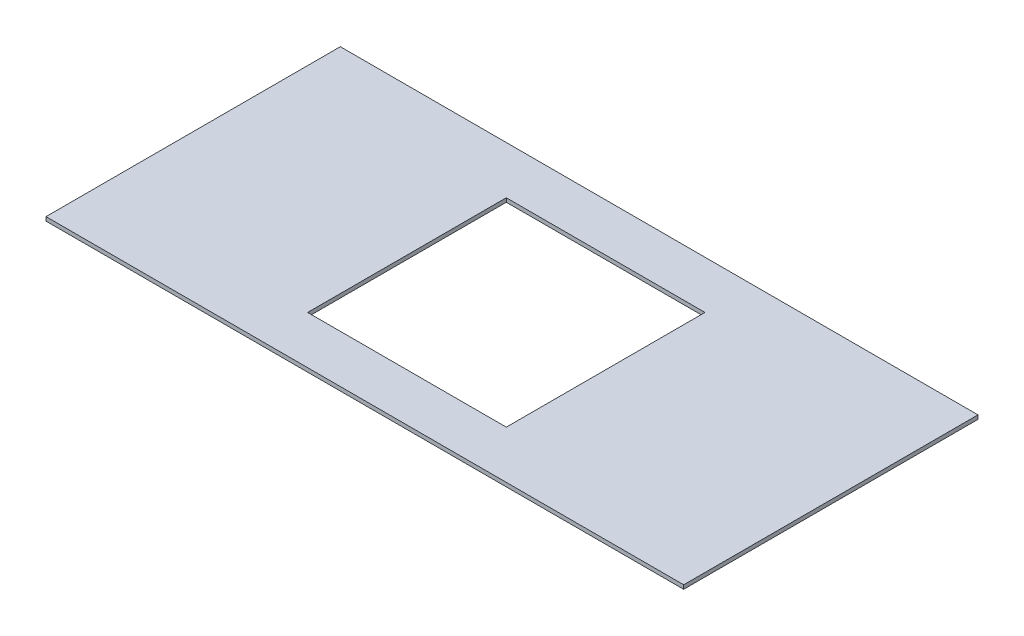
ISO-10303-21;
HEADER;
FILE_DESCRIPTION(('STEP AP214'),'2;1');
FILE_NAME('part.step','',(''),(''),'','','');
FILE_SCHEMA(('AUTOMOTIVE_DESIGN { 1 0 10303 214 1 1 1 1 }'));
ENDSEC;
DATA;
#1=APPLICATION_CONTEXT('core data for automotive mechanical design processes');
#2=APPLICATION_PROTOCOL_DEFINITION('international standard','automotive_design',2000,#1);
#3=PRODUCT_CONTEXT('',#1,'mechanical');
#4=PRODUCT('Part','Part','',(#3));
#5=PRODUCT_RELATED_PRODUCT_CATEGORY('part','',(#4));
#6=PRODUCT_DEFINITION_FORMATION('','',#4);
#7=PRODUCT_DEFINITION_CONTEXT('part definition',#1,'design');
#8=PRODUCT_DEFINITION('design','',#6,#7);
#9=PRODUCT_DEFINITION_SHAPE('','',#8);
#10=(LENGTH_UNIT() NAMED_UNIT(*) SI_UNIT(.MILLI.,.METRE.));
#11=(NAMED_UNIT(*) PLANE_ANGLE_UNIT() SI_UNIT($,.RADIAN.));
#12=(NAMED_UNIT(*) SI_UNIT($,.STERADIAN.) SOLID_ANGLE_UNIT());
#13=UNCERTAINTY_MEASURE_WITH_UNIT(LENGTH_MEASURE(1.E-05),#10,'distance_accuracy_value','');
#14=(GEOMETRIC_REPRESENTATION_CONTEXT(3) GLOBAL_UNCERTAINTY_ASSIGNED_CONTEXT((#13)) GLOBAL_UNIT_ASSIGNED_CONTEXT((#10,
#11,#12)) REPRESENTATION_CONTEXT('',''));
#15=CARTESIAN_POINT('',(0.,0.,0.));
#16=DIRECTION('',(0.,0.,1.));
#17=DIRECTION('',(1.,0.,0.));
#18=AXIS2_PLACEMENT_3D('',#15,#16,#17);
#19=CARTESIAN_POINT('',(0.,0.8,0.));
#20=DIRECTION('',(0.,1.,0.));
#21=DIRECTION('',(0.,0.,1.));
#22=AXIS2_PLACEMENT_3D('',#19,#20,#21);
#23=PLANE('',#22);
#24=DIRECTION('',(0.,0.,-1.));
#25=VECTOR('',#24,1.);
#26=CARTESIAN_POINT('',(64.9999999999999,0.8,-30.));
#27=LINE('',#26,#25);
#28=CARTESIAN_POINT('',(65.,0.8,30.));
#29=VERTEX_POINT('',#28);
#30=CARTESIAN_POINT('',(64.9999999999999,0.8,-30.));
#31=VERTEX_POINT('',#30);
#32=EDGE_CURVE('E136',#29,#31,#27,.T.);
#33=ORIENTED_EDGE('',*,*,#32,.T.);
#34=DIRECTION('',(-1.,0.,0.));
#35=VECTOR('',#34,1.);
#36=CARTESIAN_POINT('',(-65.0000000000001,0.8,-30.));
#37=LINE('',#36,#35);
#38=CARTESIAN_POINT('',(-65.0000000000001,0.8,-30.));
#39=VERTEX_POINT('',#38);
#40=EDGE_CURVE('E139',#31,#39,#37,.T.);
#41=ORIENTED_EDGE('',*,*,#40,.T.);
#42=DIRECTION('',(0.,0.,1.));
#43=VECTOR('',#42,1.);
#44=CARTESIAN_POINT('',(-65.0000000000001,0.8,-30.));
#45=LINE('',#44,#43);
#46=CARTESIAN_POINT('',(-65.,0.8,30.));
#47=VERTEX_POINT('',#46);
#48=EDGE_CURVE('E142',#39,#47,#45,.T.);
#49=ORIENTED_EDGE('',*,*,#48,.T.);
#50=DIRECTION('',(1.,0.,0.));
#51=VECTOR('',#50,1.);
#52=CARTESIAN_POINT('',(-65.,0.8,30.));
#53=LINE('',#52,#51);
#54=EDGE_CURVE('E144',#47,#29,#53,.T.);
#55=ORIENTED_EDGE('',*,*,#54,.T.);
#56=EDGE_LOOP('',(#33,#41,#49,#55));
#57=FACE_BOUND('',#56,.T.);
#58=DIRECTION('',(1.,0.,0.));
#59=VECTOR('',#58,1.);
#60=CARTESIAN_POINT('',(0.,0.8,-20.25));
#61=LINE('',#60,#59);
#62=CARTESIAN_POINT('',(-21.4136230187586,0.8,-20.25));
#63=VERTEX_POINT('',#62);
#64=CARTESIAN_POINT('',(19.0863769812414,0.8,-20.25));
#65=VERTEX_POINT('',#64);
#66=EDGE_CURVE('E132',#63,#65,#61,.T.);
#67=ORIENTED_EDGE('',*,*,#66,.T.);
#68=DIRECTION('',(0.,0.,1.));
#69=VECTOR('',#68,1.);
#70=CARTESIAN_POINT('',(19.0863769812414,0.8,0.));
#71=LINE('',#70,#69);
#72=CARTESIAN_POINT('',(19.0863769812414,0.8,20.25));
#73=VERTEX_POINT('',#72);
#74=EDGE_CURVE('E101',#65,#73,#71,.T.);
#75=ORIENTED_EDGE('',*,*,#74,.T.);
#76=DIRECTION('',(-1.,0.,0.));
#77=VECTOR('',#76,1.);
#78=CARTESIAN_POINT('',(0.,0.8,20.25));
#79=LINE('',#78,#77);
#80=CARTESIAN_POINT('',(-21.4136230187586,0.8,20.25));
#81=VERTEX_POINT('',#80);
#82=EDGE_CURVE('E104',#73,#81,#79,.T.);
#83=ORIENTED_EDGE('',*,*,#82,.T.);
#84=DIRECTION('',(0.,0.,-1.));
#85=VECTOR('',#84,1.);
#86=CARTESIAN_POINT('',(-21.4136230187586,0.8,0.));
#87=LINE('',#86,#85);
#88=EDGE_CURVE('E129',#81,#63,#87,.T.);
#89=ORIENTED_EDGE('',*,*,#88,.T.);
#90=EDGE_LOOP('',(#67,#75,#83,#89));
#91=FACE_BOUND('',#90,.T.);
#92=ADVANCED_FACE('F33',(#57,#91),#23,.T.);
#93=CARTESIAN_POINT('',(0.,0.,0.));
#94=DIRECTION('',(0.,1.,0.));
#95=DIRECTION('',(0.,0.,1.));
#96=AXIS2_PLACEMENT_3D('',#93,#94,#95);
#97=PLANE('',#96);
#98=DIRECTION('',(0.,0.,-1.));
#99=VECTOR('',#98,1.);
#100=CARTESIAN_POINT('',(64.9999999999999,0.,-30.));
#101=LINE('',#100,#99);
#102=CARTESIAN_POINT('',(65.,0.,30.));
#103=VERTEX_POINT('',#102);
#104=CARTESIAN_POINT('',(64.9999999999999,0.,-30.));
#105=VERTEX_POINT('',#104);
#106=EDGE_CURVE('E135',#103,#105,#101,.T.);
#107=ORIENTED_EDGE('',*,*,#106,.F.);
#108=DIRECTION('',(1.,0.,0.));
#109=VECTOR('',#108,1.);
#110=CARTESIAN_POINT('',(-65.,0.,30.));
#111=LINE('',#110,#109);
#112=CARTESIAN_POINT('',(-65.,0.,30.));
#113=VERTEX_POINT('',#112);
#114=EDGE_CURVE('E140',#113,#103,#111,.T.);
#115=ORIENTED_EDGE('',*,*,#114,.F.);
#116=DIRECTION('',(0.,0.,1.));
#117=VECTOR('',#116,1.);
#118=CARTESIAN_POINT('',(-65.0000000000001,0.,-30.));
#119=LINE('',#118,#117);
#120=CARTESIAN_POINT('',(-65.0000000000001,0.,-30.));
#121=VERTEX_POINT('',#120);
#122=EDGE_CURVE('E151',#121,#113,#119,.T.);
#123=ORIENTED_EDGE('',*,*,#122,.F.);
#124=DIRECTION('',(-1.,0.,0.));
#125=VECTOR('',#124,1.);
#126=CARTESIAN_POINT('',(-65.0000000000001,0.,-30.));
#127=LINE('',#126,#125);
#128=EDGE_CURVE('E149',#105,#121,#127,.T.);
#129=ORIENTED_EDGE('',*,*,#128,.F.);
#130=EDGE_LOOP('',(#107,#115,#123,#129));
#131=FACE_BOUND('',#130,.T.);
#132=DIRECTION('',(0.,0.,-1.));
#133=VECTOR('',#132,1.);
#134=CARTESIAN_POINT('',(19.0863769812414,0.,-20.25));
#135=LINE('',#134,#133);
#136=CARTESIAN_POINT('',(19.0863769812414,0.,20.25));
#137=VERTEX_POINT('',#136);
#138=CARTESIAN_POINT('',(19.0863769812414,0.,-20.25));
#139=VERTEX_POINT('',#138);
#140=EDGE_CURVE('E56',#137,#139,#135,.T.);
#141=ORIENTED_EDGE('',*,*,#140,.T.);
#142=DIRECTION('',(-1.,0.,0.));
#143=VECTOR('',#142,1.);
#144=CARTESIAN_POINT('',(-21.4136230187586,0.,-20.25));
#145=LINE('',#144,#143);
#146=CARTESIAN_POINT('',(-21.4136230187586,0.,-20.25));
#147=VERTEX_POINT('',#146);
#148=EDGE_CURVE('E108',#139,#147,#145,.T.);
#149=ORIENTED_EDGE('',*,*,#148,.T.);
#150=DIRECTION('',(0.,0.,1.));
#151=VECTOR('',#150,1.);
#152=CARTESIAN_POINT('',(-21.4136230187586,0.,-20.25));
#153=LINE('',#152,#151);
#154=CARTESIAN_POINT('',(-21.4136230187586,0.,20.25));
#155=VERTEX_POINT('',#154);
#156=EDGE_CURVE('E114',#147,#155,#153,.T.);
#157=ORIENTED_EDGE('',*,*,#156,.T.);
#158=DIRECTION('',(1.,0.,0.));
#159=VECTOR('',#158,1.);
#160=CARTESIAN_POINT('',(-21.4136230187586,0.,20.25));
#161=LINE('',#160,#159);
#162=EDGE_CURVE('E118',#155,#137,#161,.T.);
#163=ORIENTED_EDGE('',*,*,#162,.T.);
#164=EDGE_LOOP('',(#141,#149,#157,#163));
#165=FACE_BOUND('',#164,.T.);
#166=ADVANCED_FACE('F117',(#131,#165),#97,.F.);
#167=CARTESIAN_POINT('',(64.9999999999999,0.8,-30.));
#168=DIRECTION('',(-1.,0.,0.));
#169=DIRECTION('',(0.,0.,1.));
#170=AXIS2_PLACEMENT_3D('',#167,#168,#169);
#171=PLANE('',#170);
#172=ORIENTED_EDGE('',*,*,#106,.T.);
#173=DIRECTION('',(0.,-1.,0.));
#174=VECTOR('',#173,1.);
#175=CARTESIAN_POINT('',(64.9999999999999,0.8,-30.));
#176=LINE('',#175,#174);
#177=EDGE_CURVE('E11',#31,#105,#176,.T.);
#178=ORIENTED_EDGE('',*,*,#177,.F.);
#179=ORIENTED_EDGE('',*,*,#32,.F.);
#180=DIRECTION('',(0.,-1.,0.));
#181=VECTOR('',#180,1.);
#182=CARTESIAN_POINT('',(65.,0.8,30.));
#183=LINE('',#182,#181);
#184=EDGE_CURVE('E146',#29,#103,#183,.T.);
#185=ORIENTED_EDGE('',*,*,#184,.T.);
#186=EDGE_LOOP('',(#172,#178,#179,#185));
#187=FACE_BOUND('',#186,.T.);
#188=ADVANCED_FACE('F35',(#187),#171,.F.);
#189=CARTESIAN_POINT('',(-65.0000000000001,0.8,-30.));
#190=DIRECTION('',(0.,0.,1.));
#191=DIRECTION('',(1.,0.,0.));
#192=AXIS2_PLACEMENT_3D('',#189,#190,#191);
#193=PLANE('',#192);
#194=ORIENTED_EDGE('',*,*,#128,.T.);
#195=DIRECTION('',(0.,-1.,0.));
#196=VECTOR('',#195,1.);
#197=CARTESIAN_POINT('',(-65.0000000000001,0.8,-30.));
#198=LINE('',#197,#196);
#199=EDGE_CURVE('E41',#39,#121,#198,.T.);
#200=ORIENTED_EDGE('',*,*,#199,.F.);
#201=ORIENTED_EDGE('',*,*,#40,.F.);
#202=ORIENTED_EDGE('',*,*,#177,.T.);
#203=EDGE_LOOP('',(#194,#200,#201,#202));
#204=FACE_BOUND('',#203,.T.);
#205=ADVANCED_FACE('F178',(#204),#193,.F.);
#206=CARTESIAN_POINT('',(-65.0000000000001,0.8,-30.));
#207=DIRECTION('',(1.,0.,0.));
#208=DIRECTION('',(0.,0.,-1.));
#209=AXIS2_PLACEMENT_3D('',#206,#207,#208);
#210=PLANE('',#209);
#211=ORIENTED_EDGE('',*,*,#122,.T.);
#212=DIRECTION('',(0.,-1.,0.));
#213=VECTOR('',#212,1.);
#214=CARTESIAN_POINT('',(-65.,0.8,30.));
#215=LINE('',#214,#213);
#216=EDGE_CURVE('E156',#47,#113,#215,.T.);
#217=ORIENTED_EDGE('',*,*,#216,.F.);
#218=ORIENTED_EDGE('',*,*,#48,.F.);
#219=ORIENTED_EDGE('',*,*,#199,.T.);
#220=EDGE_LOOP('',(#211,#217,#218,#219));
#221=FACE_BOUND('',#220,.T.);
#222=ADVANCED_FACE('F163',(#221),#210,.F.);
#223=CARTESIAN_POINT('',(-65.,0.8,30.));
#224=DIRECTION('',(0.,0.,-1.));
#225=DIRECTION('',(-1.,0.,0.));
#226=AXIS2_PLACEMENT_3D('',#223,#224,#225);
#227=PLANE('',#226);
#228=ORIENTED_EDGE('',*,*,#114,.T.);
#229=ORIENTED_EDGE('',*,*,#184,.F.);
#230=ORIENTED_EDGE('',*,*,#54,.F.);
#231=ORIENTED_EDGE('',*,*,#216,.T.);
#232=EDGE_LOOP('',(#228,#229,#230,#231));
#233=FACE_BOUND('',#232,.T.);
#234=ADVANCED_FACE('F171',(#233),#227,.F.);
#235=CARTESIAN_POINT('',(19.0863769812414,3.,-20.25));
#236=DIRECTION('',(-1.,0.,0.));
#237=DIRECTION('',(0.,0.,1.));
#238=AXIS2_PLACEMENT_3D('',#235,#236,#237);
#239=PLANE('',#238);
#240=DIRECTION('',(0.,-1.,0.));
#241=VECTOR('',#240,1.);
#242=CARTESIAN_POINT('',(19.0863769812414,3.,-20.25));
#243=LINE('',#242,#241);
#244=EDGE_CURVE('E97',#65,#139,#243,.T.);
#245=ORIENTED_EDGE('',*,*,#244,.T.);
#246=ORIENTED_EDGE('',*,*,#140,.F.);
#247=DIRECTION('',(0.,-1.,0.));
#248=VECTOR('',#247,1.);
#249=CARTESIAN_POINT('',(19.0863769812414,3.,20.25));
#250=LINE('',#249,#248);
#251=EDGE_CURVE('E123',#73,#137,#250,.T.);
#252=ORIENTED_EDGE('',*,*,#251,.F.);
#253=ORIENTED_EDGE('',*,*,#74,.F.);
#254=EDGE_LOOP('',(#245,#246,#252,#253));
#255=FACE_BOUND('',#254,.T.);
#256=ADVANCED_FACE('F99',(#255),#239,.T.);
#257=CARTESIAN_POINT('',(-21.4136230187586,3.,-20.25));
#258=DIRECTION('',(0.,0.,1.));
#259=DIRECTION('',(1.,0.,0.));
#260=AXIS2_PLACEMENT_3D('',#257,#258,#259);
#261=PLANE('',#260);
#262=DIRECTION('',(0.,-1.,0.));
#263=VECTOR('',#262,1.);
#264=CARTESIAN_POINT('',(-21.4136230187586,3.,-20.25));
#265=LINE('',#264,#263);
#266=EDGE_CURVE('E105',#63,#147,#265,.T.);
#267=ORIENTED_EDGE('',*,*,#266,.T.);
#268=ORIENTED_EDGE('',*,*,#148,.F.);
#269=ORIENTED_EDGE('',*,*,#244,.F.);
#270=ORIENTED_EDGE('',*,*,#66,.F.);
#271=EDGE_LOOP('',(#267,#268,#269,#270));
#272=FACE_BOUND('',#271,.T.);
#273=ADVANCED_FACE('F109',(#272),#261,.T.);
#274=CARTESIAN_POINT('',(-21.4136230187586,3.,-20.25));
#275=DIRECTION('',(1.,0.,0.));
#276=DIRECTION('',(0.,0.,-1.));
#277=AXIS2_PLACEMENT_3D('',#274,#275,#276);
#278=PLANE('',#277);
#279=DIRECTION('',(0.,-1.,0.));
#280=VECTOR('',#279,1.);
#281=CARTESIAN_POINT('',(-21.4136230187586,3.,20.25));
#282=LINE('',#281,#280);
#283=EDGE_CURVE('E48',#81,#155,#282,.T.);
#284=ORIENTED_EDGE('',*,*,#283,.T.);
#285=ORIENTED_EDGE('',*,*,#156,.F.);
#286=ORIENTED_EDGE('',*,*,#266,.F.);
#287=ORIENTED_EDGE('',*,*,#88,.F.);
#288=EDGE_LOOP('',(#284,#285,#286,#287));
#289=FACE_BOUND('',#288,.T.);
#290=ADVANCED_FACE('F201',(#289),#278,.T.);
#291=CARTESIAN_POINT('',(-21.4136230187586,3.,20.25));
#292=DIRECTION('',(0.,0.,-1.));
#293=DIRECTION('',(-1.,0.,0.));
#294=AXIS2_PLACEMENT_3D('',#291,#292,#293);
#295=PLANE('',#294);
#296=ORIENTED_EDGE('',*,*,#251,.T.);
#297=ORIENTED_EDGE('',*,*,#162,.F.);
#298=ORIENTED_EDGE('',*,*,#283,.F.);
#299=ORIENTED_EDGE('',*,*,#82,.F.);
#300=EDGE_LOOP('',(#296,#297,#298,#299));
#301=FACE_BOUND('',#300,.T.);
#302=ADVANCED_FACE('F205',(#301),#295,.T.);
#303=CLOSED_SHELL('',(#92,#166,#188,#205,#222,#234,#256,#273,#290,#302));
#304=MANIFOLD_SOLID_BREP('B2',#303);
#305=ADVANCED_BREP_SHAPE_REPRESENTATION('',(#18,#304),#14);
#306=SHAPE_DEFINITION_REPRESENTATION(#9,#305);
ENDSEC;
END-ISO-10303-21;
